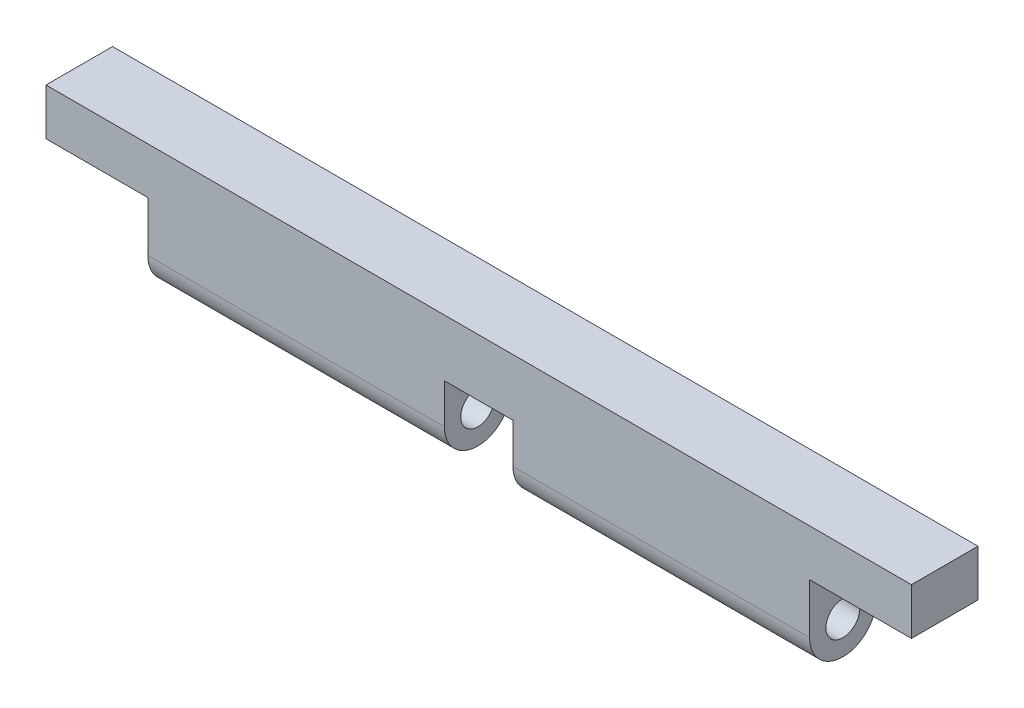
ISO-10303-21;
HEADER;
FILE_DESCRIPTION(('STEP AP214'),'2;1');
FILE_NAME('part.step','',(''),(''),'','','');
FILE_SCHEMA(('AUTOMOTIVE_DESIGN { 1 0 10303 214 1 1 1 1 }'));
ENDSEC;
DATA;
#1=APPLICATION_CONTEXT('core data for automotive mechanical design processes');
#2=APPLICATION_PROTOCOL_DEFINITION('international standard','automotive_design',2000,#1);
#3=PRODUCT_CONTEXT('',#1,'mechanical');
#4=PRODUCT('Part','Part','',(#3));
#5=PRODUCT_RELATED_PRODUCT_CATEGORY('part','',(#4));
#6=PRODUCT_DEFINITION_FORMATION('','',#4);
#7=PRODUCT_DEFINITION_CONTEXT('part definition',#1,'design');
#8=PRODUCT_DEFINITION('design','',#6,#7);
#9=PRODUCT_DEFINITION_SHAPE('','',#8);
#10=(LENGTH_UNIT() NAMED_UNIT(*) SI_UNIT(.MILLI.,.METRE.));
#11=(NAMED_UNIT(*) PLANE_ANGLE_UNIT() SI_UNIT($,.RADIAN.));
#12=(NAMED_UNIT(*) SI_UNIT($,.STERADIAN.) SOLID_ANGLE_UNIT());
#13=UNCERTAINTY_MEASURE_WITH_UNIT(LENGTH_MEASURE(1.E-05),#10,'distance_accuracy_value','');
#14=(GEOMETRIC_REPRESENTATION_CONTEXT(3) GLOBAL_UNCERTAINTY_ASSIGNED_CONTEXT((#13)) GLOBAL_UNIT_ASSIGNED_CONTEXT((#10,
#11,#12)) REPRESENTATION_CONTEXT('',''));
#15=CARTESIAN_POINT('',(0.,0.,0.));
#16=DIRECTION('',(0.,0.,1.));
#17=DIRECTION('',(1.,0.,0.));
#18=AXIS2_PLACEMENT_3D('',#15,#16,#17);
#19=CARTESIAN_POINT('',(49.7,0.,5.));
#20=DIRECTION('',(-1.,0.,0.));
#21=DIRECTION('',(0.,0.,1.));
#22=AXIS2_PLACEMENT_3D('',#19,#20,#21);
#23=PLANE('',#22);
#24=CARTESIAN_POINT('',(49.7,-5.95,0.));
#25=DIRECTION('',(-1.,0.,0.));
#26=DIRECTION('',(0.,0.,1.));
#27=AXIS2_PLACEMENT_3D('',#24,#25,#26);
#28=CIRCLE('',#27,2.55);
#29=CARTESIAN_POINT('',(49.7,-5.95,2.55));
#30=VERTEX_POINT('',#29);
#31=EDGE_CURVE('E188',#30,#30,#28,.T.);
#32=ORIENTED_EDGE('',*,*,#31,.T.);
#33=EDGE_LOOP('',(#32));
#34=FACE_BOUND('',#33,.T.);
#35=DIRECTION('',(0.,1.,0.));
#36=VECTOR('',#35,1.);
#37=CARTESIAN_POINT('',(49.7,0.,5.));
#38=LINE('',#37,#36);
#39=CARTESIAN_POINT('',(49.7,-6.,5.));
#40=VERTEX_POINT('',#39);
#41=CARTESIAN_POINT('',(49.7,1.55,5.));
#42=VERTEX_POINT('',#41);
#43=EDGE_CURVE('E139',#40,#42,#38,.T.);
#44=ORIENTED_EDGE('',*,*,#43,.F.);
#45=CARTESIAN_POINT('',(49.7,-6.,0.));
#46=DIRECTION('',(-1.,0.,0.));
#47=DIRECTION('',(0.,0.,1.));
#48=AXIS2_PLACEMENT_3D('',#45,#46,#47);
#49=CIRCLE('',#48,5.);
#50=CARTESIAN_POINT('',(49.7,-11.,0.));
#51=VERTEX_POINT('',#50);
#52=EDGE_CURVE('E239',#40,#51,#49,.F.);
#53=ORIENTED_EDGE('',*,*,#52,.T.);
#54=CARTESIAN_POINT('',(49.7,-6.,0.));
#55=DIRECTION('',(-1.,0.,0.));
#56=DIRECTION('',(0.,0.,1.));
#57=AXIS2_PLACEMENT_3D('',#54,#55,#56);
#58=CIRCLE('',#57,5.);
#59=CARTESIAN_POINT('',(49.7,-6.,-5.));
#60=VERTEX_POINT('',#59);
#61=EDGE_CURVE('E237',#51,#60,#58,.F.);
#62=ORIENTED_EDGE('',*,*,#61,.T.);
#63=DIRECTION('',(0.,1.,0.));
#64=VECTOR('',#63,1.);
#65=CARTESIAN_POINT('',(49.7,0.,-5.));
#66=LINE('',#65,#64);
#67=CARTESIAN_POINT('',(49.7,1.55,-5.));
#68=VERTEX_POINT('',#67);
#69=EDGE_CURVE('E153',#60,#68,#66,.T.);
#70=ORIENTED_EDGE('',*,*,#69,.T.);
#71=DIRECTION('',(0.,0.,-1.));
#72=VECTOR('',#71,1.);
#73=CARTESIAN_POINT('',(49.7,1.55,5.));
#74=LINE('',#73,#72);
#75=EDGE_CURVE('E151',#42,#68,#74,.T.);
#76=ORIENTED_EDGE('',*,*,#75,.F.);
#77=EDGE_LOOP('',(#44,#53,#62,#70,#76));
#78=FACE_BOUND('',#77,.T.);
#79=ADVANCED_FACE('F36',(#34,#78),#23,.F.);
#80=CARTESIAN_POINT('',(0.,1.55,5.));
#81=DIRECTION('',(0.,-1.,0.));
#82=DIRECTION('',(0.,0.,-1.));
#83=AXIS2_PLACEMENT_3D('',#80,#81,#82);
#84=PLANE('',#83);
#85=DIRECTION('',(-1.,0.,0.));
#86=VECTOR('',#85,1.);
#87=CARTESIAN_POINT('',(0.,1.55,-5.));
#88=LINE('',#87,#86);
#89=CARTESIAN_POINT('',(65.,1.55,-5.));
#90=VERTEX_POINT('',#89);
#91=EDGE_CURVE('E187',#90,#68,#88,.T.);
#92=ORIENTED_EDGE('',*,*,#91,.F.);
#93=DIRECTION('',(0.,0.,-1.));
#94=VECTOR('',#93,1.);
#95=CARTESIAN_POINT('',(65.,1.55,5.));
#96=LINE('',#95,#94);
#97=CARTESIAN_POINT('',(65.,1.55,5.));
#98=VERTEX_POINT('',#97);
#99=EDGE_CURVE('E158',#98,#90,#96,.T.);
#100=ORIENTED_EDGE('',*,*,#99,.F.);
#101=DIRECTION('',(-1.,0.,0.));
#102=VECTOR('',#101,1.);
#103=CARTESIAN_POINT('',(0.,1.55,5.));
#104=LINE('',#103,#102);
#105=EDGE_CURVE('E144',#98,#42,#104,.T.);
#106=ORIENTED_EDGE('',*,*,#105,.T.);
#107=ORIENTED_EDGE('',*,*,#75,.T.);
#108=EDGE_LOOP('',(#92,#100,#106,#107));
#109=FACE_BOUND('',#108,.T.);
#110=ADVANCED_FACE('F160',(#109),#84,.T.);
#111=CARTESIAN_POINT('',(65.,0.,5.));
#112=DIRECTION('',(-1.,0.,0.));
#113=DIRECTION('',(0.,0.,1.));
#114=AXIS2_PLACEMENT_3D('',#111,#112,#113);
#115=PLANE('',#114);
#116=DIRECTION('',(0.,1.,0.));
#117=VECTOR('',#116,1.);
#118=CARTESIAN_POINT('',(65.,0.,-5.));
#119=LINE('',#118,#117);
#120=CARTESIAN_POINT('',(65.,8.55,-5.));
#121=VERTEX_POINT('',#120);
#122=EDGE_CURVE('E190',#90,#121,#119,.T.);
#123=ORIENTED_EDGE('',*,*,#122,.T.);
#124=DIRECTION('',(0.,0.,-1.));
#125=VECTOR('',#124,1.);
#126=CARTESIAN_POINT('',(65.,8.55,5.));
#127=LINE('',#126,#125);
#128=CARTESIAN_POINT('',(65.,8.55,5.));
#129=VERTEX_POINT('',#128);
#130=EDGE_CURVE('E222',#129,#121,#127,.T.);
#131=ORIENTED_EDGE('',*,*,#130,.F.);
#132=DIRECTION('',(0.,1.,0.));
#133=VECTOR('',#132,1.);
#134=CARTESIAN_POINT('',(65.,0.,5.));
#135=LINE('',#134,#133);
#136=EDGE_CURVE('E162',#98,#129,#135,.T.);
#137=ORIENTED_EDGE('',*,*,#136,.F.);
#138=ORIENTED_EDGE('',*,*,#99,.T.);
#139=EDGE_LOOP('',(#123,#131,#137,#138));
#140=FACE_BOUND('',#139,.T.);
#141=ADVANCED_FACE('F288',(#140),#115,.F.);
#142=CARTESIAN_POINT('',(0.,8.55,5.));
#143=DIRECTION('',(0.,1.,0.));
#144=DIRECTION('',(0.,0.,1.));
#145=AXIS2_PLACEMENT_3D('',#142,#143,#144);
#146=PLANE('',#145);
#147=DIRECTION('',(1.,0.,0.));
#148=VECTOR('',#147,1.);
#149=CARTESIAN_POINT('',(0.,8.55,-5.));
#150=LINE('',#149,#148);
#151=CARTESIAN_POINT('',(-65.,8.55,-5.));
#152=VERTEX_POINT('',#151);
#153=EDGE_CURVE('E193',#152,#121,#150,.T.);
#154=ORIENTED_EDGE('',*,*,#153,.F.);
#155=DIRECTION('',(0.,0.,-1.));
#156=VECTOR('',#155,1.);
#157=CARTESIAN_POINT('',(-65.,8.55,5.));
#158=LINE('',#157,#156);
#159=CARTESIAN_POINT('',(-65.,8.55,5.));
#160=VERTEX_POINT('',#159);
#161=EDGE_CURVE('E220',#160,#152,#158,.T.);
#162=ORIENTED_EDGE('',*,*,#161,.F.);
#163=DIRECTION('',(1.,0.,0.));
#164=VECTOR('',#163,1.);
#165=CARTESIAN_POINT('',(0.,8.55,5.));
#166=LINE('',#165,#164);
#167=EDGE_CURVE('E164',#160,#129,#166,.T.);
#168=ORIENTED_EDGE('',*,*,#167,.T.);
#169=ORIENTED_EDGE('',*,*,#130,.T.);
#170=EDGE_LOOP('',(#154,#162,#168,#169));
#171=FACE_BOUND('',#170,.T.);
#172=ADVANCED_FACE('F285',(#171),#146,.T.);
#173=CARTESIAN_POINT('',(-65.,0.,5.));
#174=DIRECTION('',(-1.,0.,0.));
#175=DIRECTION('',(0.,0.,1.));
#176=AXIS2_PLACEMENT_3D('',#173,#174,#175);
#177=PLANE('',#176);
#178=DIRECTION('',(0.,1.,0.));
#179=VECTOR('',#178,1.);
#180=CARTESIAN_POINT('',(-65.,0.,-5.));
#181=LINE('',#180,#179);
#182=CARTESIAN_POINT('',(-65.,1.55,-5.));
#183=VERTEX_POINT('',#182);
#184=EDGE_CURVE('E196',#183,#152,#181,.T.);
#185=ORIENTED_EDGE('',*,*,#184,.F.);
#186=DIRECTION('',(0.,0.,-1.));
#187=VECTOR('',#186,1.);
#188=CARTESIAN_POINT('',(-65.,1.55,5.));
#189=LINE('',#188,#187);
#190=CARTESIAN_POINT('',(-65.,1.55,5.));
#191=VERTEX_POINT('',#190);
#192=EDGE_CURVE('E218',#191,#183,#189,.T.);
#193=ORIENTED_EDGE('',*,*,#192,.F.);
#194=DIRECTION('',(0.,1.,0.));
#195=VECTOR('',#194,1.);
#196=CARTESIAN_POINT('',(-65.,0.,5.));
#197=LINE('',#196,#195);
#198=EDGE_CURVE('E170',#191,#160,#197,.T.);
#199=ORIENTED_EDGE('',*,*,#198,.T.);
#200=ORIENTED_EDGE('',*,*,#161,.T.);
#201=EDGE_LOOP('',(#185,#193,#199,#200));
#202=FACE_BOUND('',#201,.T.);
#203=ADVANCED_FACE('F282',(#202),#177,.T.);
#204=CARTESIAN_POINT('',(0.,1.55000000000001,5.));
#205=DIRECTION('',(0.,-1.,0.));
#206=DIRECTION('',(1.,0.,0.));
#207=AXIS2_PLACEMENT_3D('',#204,#205,#206);
#208=PLANE('',#207);
#209=DIRECTION('',(-1.,0.,0.));
#210=VECTOR('',#209,1.);
#211=CARTESIAN_POINT('',(0.,1.55000000000001,-5.));
#212=LINE('',#211,#210);
#213=CARTESIAN_POINT('',(-49.7,1.55,-5.));
#214=VERTEX_POINT('',#213);
#215=EDGE_CURVE('E199',#214,#183,#212,.T.);
#216=ORIENTED_EDGE('',*,*,#215,.F.);
#217=DIRECTION('',(0.,0.,-1.));
#218=VECTOR('',#217,1.);
#219=CARTESIAN_POINT('',(-49.7,1.55,5.));
#220=LINE('',#219,#218);
#221=CARTESIAN_POINT('',(-49.7,1.55,5.));
#222=VERTEX_POINT('',#221);
#223=EDGE_CURVE('E215',#222,#214,#220,.T.);
#224=ORIENTED_EDGE('',*,*,#223,.F.);
#225=DIRECTION('',(-1.,0.,0.));
#226=VECTOR('',#225,1.);
#227=CARTESIAN_POINT('',(0.,1.55000000000001,5.));
#228=LINE('',#227,#226);
#229=EDGE_CURVE('E173',#222,#191,#228,.T.);
#230=ORIENTED_EDGE('',*,*,#229,.T.);
#231=ORIENTED_EDGE('',*,*,#192,.T.);
#232=EDGE_LOOP('',(#216,#224,#230,#231));
#233=FACE_BOUND('',#232,.T.);
#234=ADVANCED_FACE('F277',(#233),#208,.T.);
#235=CARTESIAN_POINT('',(-49.7,0.,5.));
#236=DIRECTION('',(-1.,0.,0.));
#237=DIRECTION('',(0.,0.,1.));
#238=AXIS2_PLACEMENT_3D('',#235,#236,#237);
#239=PLANE('',#238);
#240=CARTESIAN_POINT('',(-49.7,-5.95,0.));
#241=DIRECTION('',(-1.,0.,0.));
#242=DIRECTION('',(0.,0.,1.));
#243=AXIS2_PLACEMENT_3D('',#240,#241,#242);
#244=CIRCLE('',#243,2.55);
#245=CARTESIAN_POINT('',(-49.7,-5.95,2.55));
#246=VERTEX_POINT('',#245);
#247=EDGE_CURVE('E347',#246,#246,#244,.T.);
#248=ORIENTED_EDGE('',*,*,#247,.F.);
#249=EDGE_LOOP('',(#248));
#250=FACE_BOUND('',#249,.T.);
#251=CARTESIAN_POINT('',(-49.7,-6.,0.));
#252=DIRECTION('',(-1.,0.,0.));
#253=DIRECTION('',(0.,0.,1.));
#254=AXIS2_PLACEMENT_3D('',#251,#252,#253);
#255=CIRCLE('',#254,5.);
#256=CARTESIAN_POINT('',(-49.7,-6.,-5.));
#257=VERTEX_POINT('',#256);
#258=CARTESIAN_POINT('',(-49.7,-11.,0.));
#259=VERTEX_POINT('',#258);
#260=EDGE_CURVE('E53',#257,#259,#255,.T.);
#261=ORIENTED_EDGE('',*,*,#260,.T.);
#262=CARTESIAN_POINT('',(-49.7,-6.,0.));
#263=DIRECTION('',(-1.,0.,0.));
#264=DIRECTION('',(0.,0.,1.));
#265=AXIS2_PLACEMENT_3D('',#262,#263,#264);
#266=CIRCLE('',#265,5.);
#267=CARTESIAN_POINT('',(-49.7,-6.,5.));
#268=VERTEX_POINT('',#267);
#269=EDGE_CURVE('E246',#259,#268,#266,.T.);
#270=ORIENTED_EDGE('',*,*,#269,.T.);
#271=DIRECTION('',(0.,1.,0.));
#272=VECTOR('',#271,1.);
#273=CARTESIAN_POINT('',(-49.7,0.,5.));
#274=LINE('',#273,#272);
#275=EDGE_CURVE('E176',#268,#222,#274,.T.);
#276=ORIENTED_EDGE('',*,*,#275,.T.);
#277=ORIENTED_EDGE('',*,*,#223,.T.);
#278=DIRECTION('',(0.,1.,0.));
#279=VECTOR('',#278,1.);
#280=CARTESIAN_POINT('',(-49.7,0.,-5.));
#281=LINE('',#280,#279);
#282=EDGE_CURVE('E202',#257,#214,#281,.T.);
#283=ORIENTED_EDGE('',*,*,#282,.F.);
#284=EDGE_LOOP('',(#261,#270,#276,#277,#283));
#285=FACE_BOUND('',#284,.T.);
#286=ADVANCED_FACE('F274',(#250,#285),#239,.T.);
#287=CARTESIAN_POINT('',(-5.15,0.,5.));
#288=DIRECTION('',(-1.,0.,0.));
#289=DIRECTION('',(0.,0.,1.));
#290=AXIS2_PLACEMENT_3D('',#287,#288,#289);
#291=PLANE('',#290);
#292=CARTESIAN_POINT('',(-5.15,-5.95,0.));
#293=DIRECTION('',(-1.,0.,0.));
#294=DIRECTION('',(0.,0.,1.));
#295=AXIS2_PLACEMENT_3D('',#292,#293,#294);
#296=CIRCLE('',#295,2.55);
#297=CARTESIAN_POINT('',(-5.15,-5.95,2.55));
#298=VERTEX_POINT('',#297);
#299=EDGE_CURVE('E228',#298,#298,#296,.T.);
#300=ORIENTED_EDGE('',*,*,#299,.T.);
#301=EDGE_LOOP('',(#300));
#302=FACE_BOUND('',#301,.T.);
#303=DIRECTION('',(0.,1.,0.));
#304=VECTOR('',#303,1.);
#305=CARTESIAN_POINT('',(-5.15,0.,5.));
#306=LINE('',#305,#304);
#307=CARTESIAN_POINT('',(-5.15,-6.,5.));
#308=VERTEX_POINT('',#307);
#309=CARTESIAN_POINT('',(-5.15,0.,5.));
#310=VERTEX_POINT('',#309);
#311=EDGE_CURVE('E178',#308,#310,#306,.T.);
#312=ORIENTED_EDGE('',*,*,#311,.F.);
#313=CARTESIAN_POINT('',(-5.15,-6.,0.));
#314=DIRECTION('',(-1.,0.,0.));
#315=DIRECTION('',(0.,0.,1.));
#316=AXIS2_PLACEMENT_3D('',#313,#314,#315);
#317=CIRCLE('',#316,5.);
#318=CARTESIAN_POINT('',(-5.15,-11.,0.));
#319=VERTEX_POINT('',#318);
#320=EDGE_CURVE('E243',#308,#319,#317,.F.);
#321=ORIENTED_EDGE('',*,*,#320,.T.);
#322=CARTESIAN_POINT('',(-5.15,-6.,0.));
#323=DIRECTION('',(-1.,0.,0.));
#324=DIRECTION('',(0.,0.,1.));
#325=AXIS2_PLACEMENT_3D('',#322,#323,#324);
#326=CIRCLE('',#325,5.);
#327=CARTESIAN_POINT('',(-5.15,-6.,-5.));
#328=VERTEX_POINT('',#327);
#329=EDGE_CURVE('E241',#319,#328,#326,.F.);
#330=ORIENTED_EDGE('',*,*,#329,.T.);
#331=DIRECTION('',(0.,1.,0.));
#332=VECTOR('',#331,1.);
#333=CARTESIAN_POINT('',(-5.15,0.,-5.));
#334=LINE('',#333,#332);
#335=CARTESIAN_POINT('',(-5.15,0.,-5.));
#336=VERTEX_POINT('',#335);
#337=EDGE_CURVE('E204',#328,#336,#334,.T.);
#338=ORIENTED_EDGE('',*,*,#337,.T.);
#339=DIRECTION('',(0.,0.,-1.));
#340=VECTOR('',#339,1.);
#341=CARTESIAN_POINT('',(-5.15,0.,5.));
#342=LINE('',#341,#340);
#343=EDGE_CURVE('E212',#310,#336,#342,.T.);
#344=ORIENTED_EDGE('',*,*,#343,.F.);
#345=EDGE_LOOP('',(#312,#321,#330,#338,#344));
#346=FACE_BOUND('',#345,.T.);
#347=ADVANCED_FACE('F261',(#302,#346),#291,.F.);
#348=CARTESIAN_POINT('',(0.,0.,5.));
#349=DIRECTION('',(0.,1.,0.));
#350=DIRECTION('',(0.,0.,1.));
#351=AXIS2_PLACEMENT_3D('',#348,#349,#350);
#352=PLANE('',#351);
#353=DIRECTION('',(1.,0.,0.));
#354=VECTOR('',#353,1.);
#355=CARTESIAN_POINT('',(0.,0.,-5.));
#356=LINE('',#355,#354);
#357=CARTESIAN_POINT('',(5.15,0.,-5.));
#358=VERTEX_POINT('',#357);
#359=EDGE_CURVE('E206',#336,#358,#356,.T.);
#360=ORIENTED_EDGE('',*,*,#359,.T.);
#361=DIRECTION('',(0.,0.,-1.));
#362=VECTOR('',#361,1.);
#363=CARTESIAN_POINT('',(5.15,0.,5.));
#364=LINE('',#363,#362);
#365=CARTESIAN_POINT('',(5.15,0.,5.));
#366=VERTEX_POINT('',#365);
#367=EDGE_CURVE('E185',#366,#358,#364,.T.);
#368=ORIENTED_EDGE('',*,*,#367,.F.);
#369=DIRECTION('',(1.,0.,0.));
#370=VECTOR('',#369,1.);
#371=CARTESIAN_POINT('',(0.,0.,5.));
#372=LINE('',#371,#370);
#373=EDGE_CURVE('E180',#310,#366,#372,.T.);
#374=ORIENTED_EDGE('',*,*,#373,.F.);
#375=ORIENTED_EDGE('',*,*,#343,.T.);
#376=EDGE_LOOP('',(#360,#368,#374,#375));
#377=FACE_BOUND('',#376,.T.);
#378=ADVANCED_FACE('F268',(#377),#352,.F.);
#379=CARTESIAN_POINT('',(5.15,0.,5.));
#380=DIRECTION('',(-1.,0.,0.));
#381=DIRECTION('',(0.,0.,1.));
#382=AXIS2_PLACEMENT_3D('',#379,#380,#381);
#383=PLANE('',#382);
#384=CARTESIAN_POINT('',(5.15,-5.95,0.));
#385=DIRECTION('',(-1.,0.,0.));
#386=DIRECTION('',(0.,0.,1.));
#387=AXIS2_PLACEMENT_3D('',#384,#385,#386);
#388=CIRCLE('',#387,2.55);
#389=CARTESIAN_POINT('',(5.15,-5.95,2.55));
#390=VERTEX_POINT('',#389);
#391=EDGE_CURVE('E225',#390,#390,#388,.T.);
#392=ORIENTED_EDGE('',*,*,#391,.F.);
#393=EDGE_LOOP('',(#392));
#394=FACE_BOUND('',#393,.T.);
#395=CARTESIAN_POINT('',(5.15,-6.,0.));
#396=DIRECTION('',(-1.,0.,0.));
#397=DIRECTION('',(0.,0.,1.));
#398=AXIS2_PLACEMENT_3D('',#395,#396,#397);
#399=CIRCLE('',#398,5.);
#400=CARTESIAN_POINT('',(5.15,-6.,-5.));
#401=VERTEX_POINT('',#400);
#402=CARTESIAN_POINT('',(5.15,-11.,0.));
#403=VERTEX_POINT('',#402);
#404=EDGE_CURVE('E157',#401,#403,#399,.T.);
#405=ORIENTED_EDGE('',*,*,#404,.T.);
#406=CARTESIAN_POINT('',(5.15,-6.,0.));
#407=DIRECTION('',(-1.,0.,0.));
#408=DIRECTION('',(0.,0.,1.));
#409=AXIS2_PLACEMENT_3D('',#406,#407,#408);
#410=CIRCLE('',#409,5.);
#411=CARTESIAN_POINT('',(5.15,-6.,5.));
#412=VERTEX_POINT('',#411);
#413=EDGE_CURVE('E231',#403,#412,#410,.T.);
#414=ORIENTED_EDGE('',*,*,#413,.T.);
#415=DIRECTION('',(0.,1.,0.));
#416=VECTOR('',#415,1.);
#417=CARTESIAN_POINT('',(5.15,0.,5.));
#418=LINE('',#417,#416);
#419=EDGE_CURVE('E183',#412,#366,#418,.T.);
#420=ORIENTED_EDGE('',*,*,#419,.T.);
#421=ORIENTED_EDGE('',*,*,#367,.T.);
#422=DIRECTION('',(0.,1.,0.));
#423=VECTOR('',#422,1.);
#424=CARTESIAN_POINT('',(5.15,0.,-5.));
#425=LINE('',#424,#423);
#426=EDGE_CURVE('E148',#401,#358,#425,.T.);
#427=ORIENTED_EDGE('',*,*,#426,.F.);
#428=EDGE_LOOP('',(#405,#414,#420,#421,#427));
#429=FACE_BOUND('',#428,.T.);
#430=ADVANCED_FACE('F295',(#394,#429),#383,.T.);
#431=CARTESIAN_POINT('',(0.,0.,5.));
#432=DIRECTION('',(0.,0.,1.));
#433=DIRECTION('',(1.,0.,0.));
#434=AXIS2_PLACEMENT_3D('',#431,#432,#433);
#435=PLANE('',#434);
#436=ORIENTED_EDGE('',*,*,#419,.F.);
#437=DIRECTION('',(-1.,0.,0.));
#438=VECTOR('',#437,1.);
#439=CARTESIAN_POINT('',(0.,-6.,5.));
#440=LINE('',#439,#438);
#441=EDGE_CURVE('E146',#412,#40,#440,.F.);
#442=ORIENTED_EDGE('',*,*,#441,.T.);
#443=ORIENTED_EDGE('',*,*,#43,.T.);
#444=ORIENTED_EDGE('',*,*,#105,.F.);
#445=ORIENTED_EDGE('',*,*,#136,.T.);
#446=ORIENTED_EDGE('',*,*,#167,.F.);
#447=ORIENTED_EDGE('',*,*,#198,.F.);
#448=ORIENTED_EDGE('',*,*,#229,.F.);
#449=ORIENTED_EDGE('',*,*,#275,.F.);
#450=DIRECTION('',(1.,0.,0.));
#451=VECTOR('',#450,1.);
#452=CARTESIAN_POINT('',(-5.15,-6.,5.));
#453=LINE('',#452,#451);
#454=EDGE_CURVE('E233',#268,#308,#453,.T.);
#455=ORIENTED_EDGE('',*,*,#454,.T.);
#456=ORIENTED_EDGE('',*,*,#311,.T.);
#457=ORIENTED_EDGE('',*,*,#373,.T.);
#458=EDGE_LOOP('',(#436,#442,#443,#444,#445,#446,#447,#448,#449,#455,#456,#457));
#459=FACE_BOUND('',#458,.T.);
#460=ADVANCED_FACE('F142',(#459),#435,.T.);
#461=CARTESIAN_POINT('',(0.,0.,-5.));
#462=DIRECTION('',(0.,0.,1.));
#463=DIRECTION('',(1.,0.,0.));
#464=AXIS2_PLACEMENT_3D('',#461,#462,#463);
#465=PLANE('',#464);
#466=ORIENTED_EDGE('',*,*,#69,.F.);
#467=DIRECTION('',(-1.,0.,0.));
#468=VECTOR('',#467,1.);
#469=CARTESIAN_POINT('',(5.15,-6.,-5.));
#470=LINE('',#469,#468);
#471=EDGE_CURVE('E11',#60,#401,#470,.T.);
#472=ORIENTED_EDGE('',*,*,#471,.T.);
#473=ORIENTED_EDGE('',*,*,#426,.T.);
#474=ORIENTED_EDGE('',*,*,#359,.F.);
#475=ORIENTED_EDGE('',*,*,#337,.F.);
#476=DIRECTION('',(1.,0.,0.));
#477=VECTOR('',#476,1.);
#478=CARTESIAN_POINT('',(0.,-6.,-5.));
#479=LINE('',#478,#477);
#480=EDGE_CURVE('E45',#328,#257,#479,.F.);
#481=ORIENTED_EDGE('',*,*,#480,.T.);
#482=ORIENTED_EDGE('',*,*,#282,.T.);
#483=ORIENTED_EDGE('',*,*,#215,.T.);
#484=ORIENTED_EDGE('',*,*,#184,.T.);
#485=ORIENTED_EDGE('',*,*,#153,.T.);
#486=ORIENTED_EDGE('',*,*,#122,.F.);
#487=ORIENTED_EDGE('',*,*,#91,.T.);
#488=EDGE_LOOP('',(#466,#472,#473,#474,#475,#481,#482,#483,#484,#485,#486,#487));
#489=FACE_BOUND('',#488,.T.);
#490=ADVANCED_FACE('F264',(#489),#465,.F.);
#491=CARTESIAN_POINT('',(65.,-5.95,0.));
#492=DIRECTION('',(-1.,0.,0.));
#493=DIRECTION('',(0.,0.,1.));
#494=AXIS2_PLACEMENT_3D('',#491,#492,#493);
#495=CYLINDRICAL_SURFACE('',#494,2.55);
#496=ORIENTED_EDGE('',*,*,#391,.T.);
#497=EDGE_LOOP('',(#496));
#498=FACE_BOUND('',#497,.T.);
#499=ORIENTED_EDGE('',*,*,#31,.F.);
#500=EDGE_LOOP('',(#499));
#501=FACE_BOUND('',#500,.T.);
#502=ADVANCED_FACE('F335',(#498,#501),#495,.F.);
#503=ORIENTED_EDGE('',*,*,#247,.T.);
#504=EDGE_LOOP('',(#503));
#505=FACE_BOUND('',#504,.T.);
#506=ORIENTED_EDGE('',*,*,#299,.F.);
#507=EDGE_LOOP('',(#506));
#508=FACE_BOUND('',#507,.T.);
#509=ADVANCED_FACE('F303',(#505,#508),#495,.F.);
#510=CARTESIAN_POINT('',(0.,-6.,0.));
#511=DIRECTION('',(1.,0.,0.));
#512=DIRECTION('',(0.,0.,-1.));
#513=AXIS2_PLACEMENT_3D('',#510,#511,#512);
#514=CYLINDRICAL_SURFACE('',#513,5.);
#515=ORIENTED_EDGE('',*,*,#471,.F.);
#516=ORIENTED_EDGE('',*,*,#61,.F.);
#517=DIRECTION('',(-1.,0.,0.));
#518=VECTOR('',#517,1.);
#519=CARTESIAN_POINT('',(49.7,-11.,0.));
#520=LINE('',#519,#518);
#521=EDGE_CURVE('E229',#403,#51,#520,.F.);
#522=ORIENTED_EDGE('',*,*,#521,.F.);
#523=ORIENTED_EDGE('',*,*,#404,.F.);
#524=EDGE_LOOP('',(#515,#516,#522,#523));
#525=FACE_BOUND('',#524,.T.);
#526=ADVANCED_FACE('F293',(#525),#514,.T.);
#527=CARTESIAN_POINT('',(0.,-6.,0.));
#528=DIRECTION('',(-1.,0.,0.));
#529=DIRECTION('',(0.,0.,1.));
#530=AXIS2_PLACEMENT_3D('',#527,#528,#529);
#531=CYLINDRICAL_SURFACE('',#530,5.);
#532=ORIENTED_EDGE('',*,*,#52,.F.);
#533=ORIENTED_EDGE('',*,*,#441,.F.);
#534=ORIENTED_EDGE('',*,*,#413,.F.);
#535=ORIENTED_EDGE('',*,*,#521,.T.);
#536=EDGE_LOOP('',(#532,#533,#534,#535));
#537=FACE_BOUND('',#536,.T.);
#538=ADVANCED_FACE('F296',(#537),#531,.T.);
#539=CARTESIAN_POINT('',(0.,-6.,0.));
#540=DIRECTION('',(1.,0.,0.));
#541=DIRECTION('',(0.,0.,-1.));
#542=AXIS2_PLACEMENT_3D('',#539,#540,#541);
#543=CYLINDRICAL_SURFACE('',#542,5.);
#544=DIRECTION('',(1.,0.,0.));
#545=VECTOR('',#544,1.);
#546=CARTESIAN_POINT('',(0.,-11.,0.));
#547=LINE('',#546,#545);
#548=EDGE_CURVE('E40',#259,#319,#547,.T.);
#549=ORIENTED_EDGE('',*,*,#548,.F.);
#550=ORIENTED_EDGE('',*,*,#260,.F.);
#551=ORIENTED_EDGE('',*,*,#480,.F.);
#552=ORIENTED_EDGE('',*,*,#329,.F.);
#553=EDGE_LOOP('',(#549,#550,#551,#552));
#554=FACE_BOUND('',#553,.T.);
#555=ADVANCED_FACE('F38',(#554),#543,.T.);
#556=CARTESIAN_POINT('',(0.,-6.,0.));
#557=DIRECTION('',(-1.,0.,0.));
#558=DIRECTION('',(0.,0.,1.));
#559=AXIS2_PLACEMENT_3D('',#556,#557,#558);
#560=CYLINDRICAL_SURFACE('',#559,5.);
#561=ORIENTED_EDGE('',*,*,#269,.F.);
#562=ORIENTED_EDGE('',*,*,#548,.T.);
#563=ORIENTED_EDGE('',*,*,#320,.F.);
#564=ORIENTED_EDGE('',*,*,#454,.F.);
#565=EDGE_LOOP('',(#561,#562,#563,#564));
#566=FACE_BOUND('',#565,.T.);
#567=ADVANCED_FACE('F255',(#566),#560,.T.);
#568=CLOSED_SHELL('',(#79,#110,#141,#172,#203,#234,#286,#347,#378,#430,#460,#490,#502,#509,#526,
#538,#555,#567));
#569=MANIFOLD_SOLID_BREP('B2',#568);
#570=ADVANCED_BREP_SHAPE_REPRESENTATION('',(#18,#569),#14);
#571=SHAPE_DEFINITION_REPRESENTATION(#9,#570);
ENDSEC;
END-ISO-10303-21;
